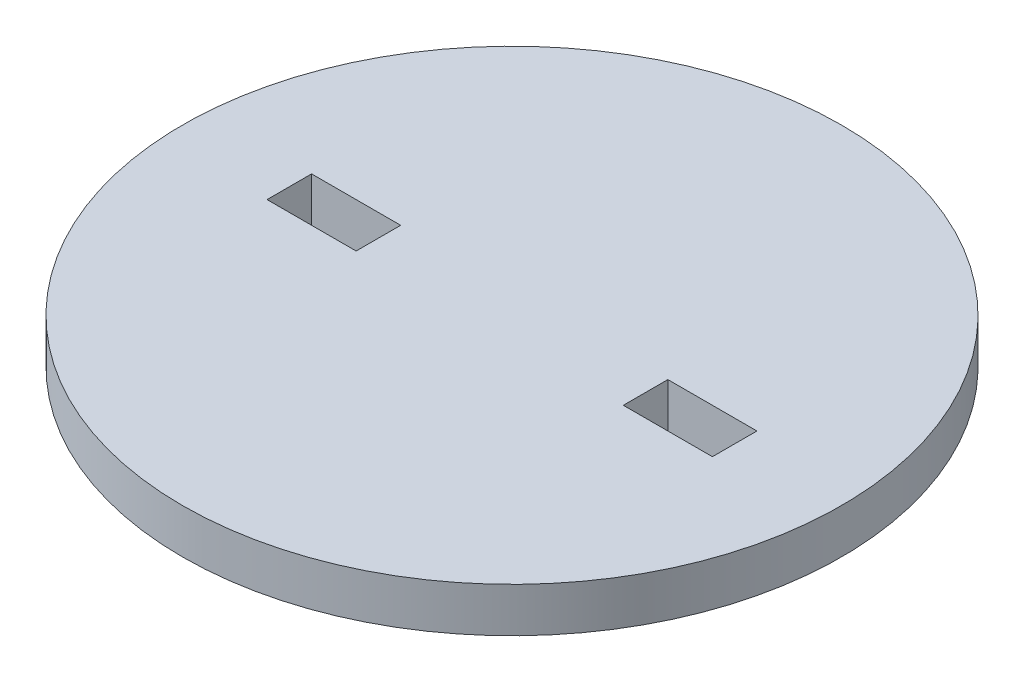
ISO-10303-21;
HEADER;
FILE_DESCRIPTION(('STEP AP214'),'2;1');
FILE_NAME('part.step','',(''),(''),'','','');
FILE_SCHEMA(('AUTOMOTIVE_DESIGN { 1 0 10303 214 1 1 1 1 }'));
ENDSEC;
DATA;
#1=APPLICATION_CONTEXT('core data for automotive mechanical design processes');
#2=APPLICATION_PROTOCOL_DEFINITION('international standard','automotive_design',2000,#1);
#3=PRODUCT_CONTEXT('',#1,'mechanical');
#4=PRODUCT('Part','Part','',(#3));
#5=PRODUCT_RELATED_PRODUCT_CATEGORY('part','',(#4));
#6=PRODUCT_DEFINITION_FORMATION('','',#4);
#7=PRODUCT_DEFINITION_CONTEXT('part definition',#1,'design');
#8=PRODUCT_DEFINITION('design','',#6,#7);
#9=PRODUCT_DEFINITION_SHAPE('','',#8);
#10=(LENGTH_UNIT() NAMED_UNIT(*) SI_UNIT(.MILLI.,.METRE.));
#11=(NAMED_UNIT(*) PLANE_ANGLE_UNIT() SI_UNIT($,.RADIAN.));
#12=(NAMED_UNIT(*) SI_UNIT($,.STERADIAN.) SOLID_ANGLE_UNIT());
#13=UNCERTAINTY_MEASURE_WITH_UNIT(LENGTH_MEASURE(1.E-05),#10,'distance_accuracy_value','');
#14=(GEOMETRIC_REPRESENTATION_CONTEXT(3) GLOBAL_UNCERTAINTY_ASSIGNED_CONTEXT((#13)) GLOBAL_UNIT_ASSIGNED_CONTEXT((#10,
#11,#12)) REPRESENTATION_CONTEXT('',''));
#15=CARTESIAN_POINT('',(0.,0.,0.));
#16=DIRECTION('',(0.,0.,1.));
#17=DIRECTION('',(1.,0.,0.));
#18=AXIS2_PLACEMENT_3D('',#15,#16,#17);
#19=CARTESIAN_POINT('',(0.,3.175,0.));
#20=DIRECTION('',(0.,-1.,0.));
#21=DIRECTION('',(0.,0.,-1.));
#22=AXIS2_PLACEMENT_3D('',#19,#20,#21);
#23=CYLINDRICAL_SURFACE('',#22,23.495);
#24=CARTESIAN_POINT('',(0.,3.175,0.));
#25=DIRECTION('',(0.,1.,0.));
#26=DIRECTION('',(0.,0.,1.));
#27=AXIS2_PLACEMENT_3D('',#24,#25,#26);
#28=CIRCLE('',#27,23.495);
#29=CARTESIAN_POINT('',(0.,3.175,23.495));
#30=VERTEX_POINT('',#29);
#31=EDGE_CURVE('E11',#30,#30,#28,.T.);
#32=ORIENTED_EDGE('',*,*,#31,.F.);
#33=EDGE_LOOP('',(#32));
#34=FACE_BOUND('',#33,.T.);
#35=CARTESIAN_POINT('',(0.,0.,0.));
#36=DIRECTION('',(0.,1.,0.));
#37=DIRECTION('',(0.,0.,1.));
#38=AXIS2_PLACEMENT_3D('',#35,#36,#37);
#39=CIRCLE('',#38,23.495);
#40=CARTESIAN_POINT('',(0.,0.,23.495));
#41=VERTEX_POINT('',#40);
#42=EDGE_CURVE('E36',#41,#41,#39,.T.);
#43=ORIENTED_EDGE('',*,*,#42,.T.);
#44=EDGE_LOOP('',(#43));
#45=FACE_BOUND('',#44,.T.);
#46=ADVANCED_FACE('F33',(#34,#45),#23,.T.);
#47=CARTESIAN_POINT('',(0.,3.175,0.));
#48=DIRECTION('',(0.,1.,0.));
#49=DIRECTION('',(0.,0.,1.));
#50=AXIS2_PLACEMENT_3D('',#47,#48,#49);
#51=PLANE('',#50);
#52=DIRECTION('',(0.,0.,1.));
#53=VECTOR('',#52,1.);
#54=CARTESIAN_POINT('',(9.52500000000001,3.175,1.5875));
#55=LINE('',#54,#53);
#56=CARTESIAN_POINT('',(9.52500000000001,3.175,-1.5875));
#57=VERTEX_POINT('',#56);
#58=CARTESIAN_POINT('',(9.52500000000001,3.175,1.5875));
#59=VERTEX_POINT('',#58);
#60=EDGE_CURVE('E47',#57,#59,#55,.T.);
#61=ORIENTED_EDGE('',*,*,#60,.F.);
#62=DIRECTION('',(-1.,0.,0.));
#63=VECTOR('',#62,1.);
#64=CARTESIAN_POINT('',(9.52500000000001,3.175,-1.5875));
#65=LINE('',#64,#63);
#66=CARTESIAN_POINT('',(15.875,3.175,-1.5875));
#67=VERTEX_POINT('',#66);
#68=EDGE_CURVE('E115',#67,#57,#65,.T.);
#69=ORIENTED_EDGE('',*,*,#68,.F.);
#70=DIRECTION('',(0.,0.,-1.));
#71=VECTOR('',#70,1.);
#72=CARTESIAN_POINT('',(15.875,3.175,1.5875));
#73=LINE('',#72,#71);
#74=CARTESIAN_POINT('',(15.875,3.175,1.5875));
#75=VERTEX_POINT('',#74);
#76=EDGE_CURVE('E118',#75,#67,#73,.T.);
#77=ORIENTED_EDGE('',*,*,#76,.F.);
#78=DIRECTION('',(1.,0.,0.));
#79=VECTOR('',#78,1.);
#80=CARTESIAN_POINT('',(9.52500000000001,3.175,1.5875));
#81=LINE('',#80,#79);
#82=EDGE_CURVE('E124',#59,#75,#81,.T.);
#83=ORIENTED_EDGE('',*,*,#82,.F.);
#84=EDGE_LOOP('',(#61,#69,#77,#83));
#85=FACE_BOUND('',#84,.T.);
#86=DIRECTION('',(0.,0.,-1.));
#87=VECTOR('',#86,1.);
#88=CARTESIAN_POINT('',(-9.52499999999999,3.175,1.5875));
#89=LINE('',#88,#87);
#90=CARTESIAN_POINT('',(-9.52499999999999,3.175,1.5875));
#91=VERTEX_POINT('',#90);
#92=CARTESIAN_POINT('',(-9.52499999999997,3.175,-1.5875));
#93=VERTEX_POINT('',#92);
#94=EDGE_CURVE('E130',#91,#93,#89,.T.);
#95=ORIENTED_EDGE('',*,*,#94,.F.);
#96=DIRECTION('',(1.,0.,0.));
#97=VECTOR('',#96,1.);
#98=CARTESIAN_POINT('',(-9.52499999999999,3.175,1.5875));
#99=LINE('',#98,#97);
#100=CARTESIAN_POINT('',(-15.875,3.175,1.5875));
#101=VERTEX_POINT('',#100);
#102=EDGE_CURVE('E138',#101,#91,#99,.T.);
#103=ORIENTED_EDGE('',*,*,#102,.F.);
#104=DIRECTION('',(0.,0.,1.));
#105=VECTOR('',#104,1.);
#106=CARTESIAN_POINT('',(-15.875,3.175,1.5875));
#107=LINE('',#106,#105);
#108=CARTESIAN_POINT('',(-15.875,3.175,-1.5875));
#109=VERTEX_POINT('',#108);
#110=EDGE_CURVE('E152',#109,#101,#107,.T.);
#111=ORIENTED_EDGE('',*,*,#110,.F.);
#112=DIRECTION('',(-1.,0.,0.));
#113=VECTOR('',#112,1.);
#114=CARTESIAN_POINT('',(-9.52499999999997,3.175,-1.5875));
#115=LINE('',#114,#113);
#116=EDGE_CURVE('E149',#93,#109,#115,.T.);
#117=ORIENTED_EDGE('',*,*,#116,.F.);
#118=EDGE_LOOP('',(#95,#103,#111,#117));
#119=FACE_BOUND('',#118,.T.);
#120=ORIENTED_EDGE('',*,*,#31,.T.);
#121=EDGE_LOOP('',(#120));
#122=FACE_BOUND('',#121,.T.);
#123=ADVANCED_FACE('F174',(#85,#119,#122),#51,.T.);
#124=CARTESIAN_POINT('',(0.,0.,0.));
#125=DIRECTION('',(0.,1.,0.));
#126=DIRECTION('',(0.,0.,1.));
#127=AXIS2_PLACEMENT_3D('',#124,#125,#126);
#128=PLANE('',#127);
#129=DIRECTION('',(-1.,0.,0.));
#130=VECTOR('',#129,1.);
#131=CARTESIAN_POINT('',(9.52500000000001,0.,-1.5875));
#132=LINE('',#131,#130);
#133=CARTESIAN_POINT('',(15.875,0.,-1.5875));
#134=VERTEX_POINT('',#133);
#135=CARTESIAN_POINT('',(9.52500000000001,0.,-1.5875));
#136=VERTEX_POINT('',#135);
#137=EDGE_CURVE('E105',#134,#136,#132,.T.);
#138=ORIENTED_EDGE('',*,*,#137,.T.);
#139=DIRECTION('',(0.,0.,1.));
#140=VECTOR('',#139,1.);
#141=CARTESIAN_POINT('',(9.52500000000001,0.,1.5875));
#142=LINE('',#141,#140);
#143=CARTESIAN_POINT('',(9.52500000000001,0.,1.5875));
#144=VERTEX_POINT('',#143);
#145=EDGE_CURVE('E99',#136,#144,#142,.T.);
#146=ORIENTED_EDGE('',*,*,#145,.T.);
#147=DIRECTION('',(1.,0.,0.));
#148=VECTOR('',#147,1.);
#149=CARTESIAN_POINT('',(9.52500000000001,0.,1.5875));
#150=LINE('',#149,#148);
#151=CARTESIAN_POINT('',(15.875,0.,1.5875));
#152=VERTEX_POINT('',#151);
#153=EDGE_CURVE('E108',#144,#152,#150,.T.);
#154=ORIENTED_EDGE('',*,*,#153,.T.);
#155=DIRECTION('',(0.,0.,-1.));
#156=VECTOR('',#155,1.);
#157=CARTESIAN_POINT('',(15.875,0.,1.5875));
#158=LINE('',#157,#156);
#159=EDGE_CURVE('E55',#152,#134,#158,.T.);
#160=ORIENTED_EDGE('',*,*,#159,.T.);
#161=EDGE_LOOP('',(#138,#146,#154,#160));
#162=FACE_BOUND('',#161,.T.);
#163=DIRECTION('',(1.,0.,0.));
#164=VECTOR('',#163,1.);
#165=CARTESIAN_POINT('',(-9.52499999999999,0.,1.5875));
#166=LINE('',#165,#164);
#167=CARTESIAN_POINT('',(-15.875,0.,1.5875));
#168=VERTEX_POINT('',#167);
#169=CARTESIAN_POINT('',(-9.52499999999999,0.,1.5875));
#170=VERTEX_POINT('',#169);
#171=EDGE_CURVE('E144',#168,#170,#166,.T.);
#172=ORIENTED_EDGE('',*,*,#171,.T.);
#173=DIRECTION('',(0.,0.,-1.));
#174=VECTOR('',#173,1.);
#175=CARTESIAN_POINT('',(-9.52499999999999,0.,1.5875));
#176=LINE('',#175,#174);
#177=CARTESIAN_POINT('',(-9.52499999999997,0.,-1.5875));
#178=VERTEX_POINT('',#177);
#179=EDGE_CURVE('E134',#170,#178,#176,.T.);
#180=ORIENTED_EDGE('',*,*,#179,.T.);
#181=DIRECTION('',(-1.,0.,0.));
#182=VECTOR('',#181,1.);
#183=CARTESIAN_POINT('',(-9.52499999999997,0.,-1.5875));
#184=LINE('',#183,#182);
#185=CARTESIAN_POINT('',(-15.875,0.,-1.5875));
#186=VERTEX_POINT('',#185);
#187=EDGE_CURVE('E137',#178,#186,#184,.T.);
#188=ORIENTED_EDGE('',*,*,#187,.T.);
#189=DIRECTION('',(0.,0.,1.));
#190=VECTOR('',#189,1.);
#191=CARTESIAN_POINT('',(-15.875,0.,1.5875));
#192=LINE('',#191,#190);
#193=EDGE_CURVE('E141',#186,#168,#192,.T.);
#194=ORIENTED_EDGE('',*,*,#193,.T.);
#195=EDGE_LOOP('',(#172,#180,#188,#194));
#196=FACE_BOUND('',#195,.T.);
#197=ORIENTED_EDGE('',*,*,#42,.F.);
#198=EDGE_LOOP('',(#197));
#199=FACE_BOUND('',#198,.T.);
#200=ADVANCED_FACE('F112',(#162,#196,#199),#128,.F.);
#201=CARTESIAN_POINT('',(-9.52499999999999,0.,1.5875));
#202=DIRECTION('',(1.,0.,0.));
#203=DIRECTION('',(0.,0.,-1.));
#204=AXIS2_PLACEMENT_3D('',#201,#202,#203);
#205=PLANE('',#204);
#206=ORIENTED_EDGE('',*,*,#94,.T.);
#207=DIRECTION('',(0.,1.,0.));
#208=VECTOR('',#207,1.);
#209=CARTESIAN_POINT('',(-9.52499999999997,0.,-1.5875));
#210=LINE('',#209,#208);
#211=EDGE_CURVE('E147',#178,#93,#210,.T.);
#212=ORIENTED_EDGE('',*,*,#211,.F.);
#213=ORIENTED_EDGE('',*,*,#179,.F.);
#214=DIRECTION('',(0.,1.,0.));
#215=VECTOR('',#214,1.);
#216=CARTESIAN_POINT('',(-9.52499999999999,0.,1.5875));
#217=LINE('',#216,#215);
#218=EDGE_CURVE('E157',#170,#91,#217,.T.);
#219=ORIENTED_EDGE('',*,*,#218,.T.);
#220=EDGE_LOOP('',(#206,#212,#213,#219));
#221=FACE_BOUND('',#220,.T.);
#222=ADVANCED_FACE('F181',(#221),#205,.F.);
#223=CARTESIAN_POINT('',(-9.52499999999999,0.,1.5875));
#224=DIRECTION('',(0.,0.,1.));
#225=DIRECTION('',(1.,0.,0.));
#226=AXIS2_PLACEMENT_3D('',#223,#224,#225);
#227=PLANE('',#226);
#228=ORIENTED_EDGE('',*,*,#102,.T.);
#229=ORIENTED_EDGE('',*,*,#218,.F.);
#230=ORIENTED_EDGE('',*,*,#171,.F.);
#231=DIRECTION('',(0.,1.,0.));
#232=VECTOR('',#231,1.);
#233=CARTESIAN_POINT('',(-15.875,0.,1.5875));
#234=LINE('',#233,#232);
#235=EDGE_CURVE('E159',#168,#101,#234,.T.);
#236=ORIENTED_EDGE('',*,*,#235,.T.);
#237=EDGE_LOOP('',(#228,#229,#230,#236));
#238=FACE_BOUND('',#237,.T.);
#239=ADVANCED_FACE('F183',(#238),#227,.F.);
#240=CARTESIAN_POINT('',(-15.875,0.,1.5875));
#241=DIRECTION('',(-1.,0.,0.));
#242=DIRECTION('',(0.,0.,1.));
#243=AXIS2_PLACEMENT_3D('',#240,#241,#242);
#244=PLANE('',#243);
#245=ORIENTED_EDGE('',*,*,#110,.T.);
#246=ORIENTED_EDGE('',*,*,#235,.F.);
#247=ORIENTED_EDGE('',*,*,#193,.F.);
#248=DIRECTION('',(0.,1.,0.));
#249=VECTOR('',#248,1.);
#250=CARTESIAN_POINT('',(-15.875,0.,-1.5875));
#251=LINE('',#250,#249);
#252=EDGE_CURVE('E161',#186,#109,#251,.T.);
#253=ORIENTED_EDGE('',*,*,#252,.T.);
#254=EDGE_LOOP('',(#245,#246,#247,#253));
#255=FACE_BOUND('',#254,.T.);
#256=ADVANCED_FACE('F178',(#255),#244,.F.);
#257=CARTESIAN_POINT('',(-9.52499999999997,0.,-1.5875));
#258=DIRECTION('',(0.,0.,-1.));
#259=DIRECTION('',(-1.,0.,0.));
#260=AXIS2_PLACEMENT_3D('',#257,#258,#259);
#261=PLANE('',#260);
#262=ORIENTED_EDGE('',*,*,#116,.T.);
#263=ORIENTED_EDGE('',*,*,#252,.F.);
#264=ORIENTED_EDGE('',*,*,#187,.F.);
#265=ORIENTED_EDGE('',*,*,#211,.T.);
#266=EDGE_LOOP('',(#262,#263,#264,#265));
#267=FACE_BOUND('',#266,.T.);
#268=ADVANCED_FACE('F167',(#267),#261,.F.);
#269=CARTESIAN_POINT('',(9.52500000000001,0.,1.5875));
#270=DIRECTION('',(-1.,0.,0.));
#271=DIRECTION('',(0.,0.,1.));
#272=AXIS2_PLACEMENT_3D('',#269,#270,#271);
#273=PLANE('',#272);
#274=ORIENTED_EDGE('',*,*,#60,.T.);
#275=DIRECTION('',(0.,1.,0.));
#276=VECTOR('',#275,1.);
#277=CARTESIAN_POINT('',(9.52500000000001,0.,1.5875));
#278=LINE('',#277,#276);
#279=EDGE_CURVE('E95',#144,#59,#278,.T.);
#280=ORIENTED_EDGE('',*,*,#279,.F.);
#281=ORIENTED_EDGE('',*,*,#145,.F.);
#282=DIRECTION('',(0.,1.,0.));
#283=VECTOR('',#282,1.);
#284=CARTESIAN_POINT('',(9.52500000000001,0.,-1.5875));
#285=LINE('',#284,#283);
#286=EDGE_CURVE('E128',#136,#57,#285,.T.);
#287=ORIENTED_EDGE('',*,*,#286,.T.);
#288=EDGE_LOOP('',(#274,#280,#281,#287));
#289=FACE_BOUND('',#288,.T.);
#290=ADVANCED_FACE('F97',(#289),#273,.F.);
#291=CARTESIAN_POINT('',(9.52500000000001,0.,-1.5875));
#292=DIRECTION('',(0.,0.,-1.));
#293=DIRECTION('',(-1.,0.,0.));
#294=AXIS2_PLACEMENT_3D('',#291,#292,#293);
#295=PLANE('',#294);
#296=ORIENTED_EDGE('',*,*,#68,.T.);
#297=ORIENTED_EDGE('',*,*,#286,.F.);
#298=ORIENTED_EDGE('',*,*,#137,.F.);
#299=DIRECTION('',(0.,1.,0.));
#300=VECTOR('',#299,1.);
#301=CARTESIAN_POINT('',(15.875,0.,-1.5875));
#302=LINE('',#301,#300);
#303=EDGE_CURVE('E131',#134,#67,#302,.T.);
#304=ORIENTED_EDGE('',*,*,#303,.T.);
#305=EDGE_LOOP('',(#296,#297,#298,#304));
#306=FACE_BOUND('',#305,.T.);
#307=ADVANCED_FACE('F212',(#306),#295,.F.);
#308=CARTESIAN_POINT('',(15.875,0.,1.5875));
#309=DIRECTION('',(1.,0.,0.));
#310=DIRECTION('',(0.,0.,-1.));
#311=AXIS2_PLACEMENT_3D('',#308,#309,#310);
#312=PLANE('',#311);
#313=ORIENTED_EDGE('',*,*,#76,.T.);
#314=ORIENTED_EDGE('',*,*,#303,.F.);
#315=ORIENTED_EDGE('',*,*,#159,.F.);
#316=DIRECTION('',(0.,1.,0.));
#317=VECTOR('',#316,1.);
#318=CARTESIAN_POINT('',(15.875,0.,1.5875));
#319=LINE('',#318,#317);
#320=EDGE_CURVE('E104',#152,#75,#319,.T.);
#321=ORIENTED_EDGE('',*,*,#320,.T.);
#322=EDGE_LOOP('',(#313,#314,#315,#321));
#323=FACE_BOUND('',#322,.T.);
#324=ADVANCED_FACE('F216',(#323),#312,.F.);
#325=CARTESIAN_POINT('',(9.52500000000001,0.,1.5875));
#326=DIRECTION('',(0.,0.,1.));
#327=DIRECTION('',(1.,0.,0.));
#328=AXIS2_PLACEMENT_3D('',#325,#326,#327);
#329=PLANE('',#328);
#330=ORIENTED_EDGE('',*,*,#82,.T.);
#331=ORIENTED_EDGE('',*,*,#320,.F.);
#332=ORIENTED_EDGE('',*,*,#153,.F.);
#333=ORIENTED_EDGE('',*,*,#279,.T.);
#334=EDGE_LOOP('',(#330,#331,#332,#333));
#335=FACE_BOUND('',#334,.T.);
#336=ADVANCED_FACE('F109',(#335),#329,.F.);
#337=CLOSED_SHELL('',(#46,#123,#200,#222,#239,#256,#268,#290,#307,#324,#336));
#338=MANIFOLD_SOLID_BREP('B2',#337);
#339=ADVANCED_BREP_SHAPE_REPRESENTATION('',(#18,#338),#14);
#340=SHAPE_DEFINITION_REPRESENTATION(#9,#339);
ENDSEC;
END-ISO-10303-21;
